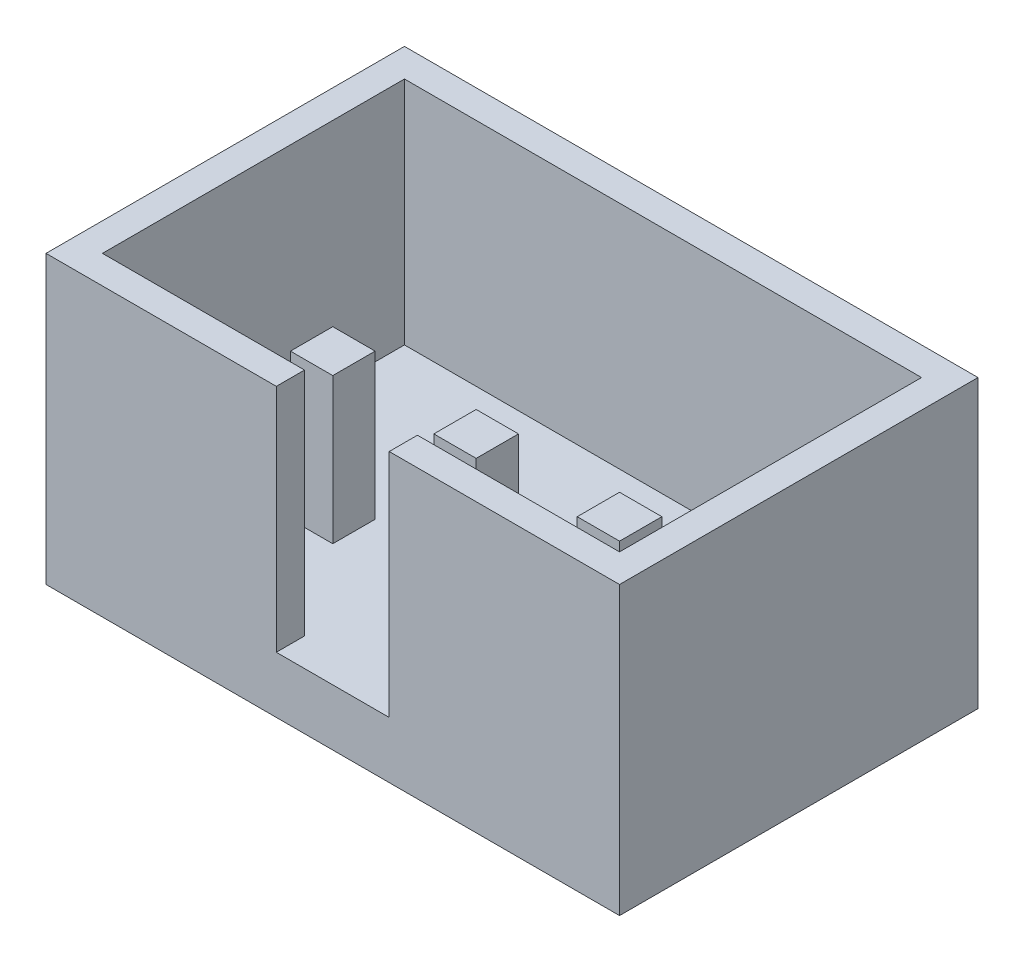
ISO-10303-21;
HEADER;
FILE_DESCRIPTION(('STEP AP214'),'2;1');
FILE_NAME('part.step','',(''),(''),'','','');
FILE_SCHEMA(('AUTOMOTIVE_DESIGN { 1 0 10303 214 1 1 1 1 }'));
ENDSEC;
DATA;
#1=APPLICATION_CONTEXT('core data for automotive mechanical design processes');
#2=APPLICATION_PROTOCOL_DEFINITION('international standard','automotive_design',2000,#1);
#3=PRODUCT_CONTEXT('',#1,'mechanical');
#4=PRODUCT('Part','Part','',(#3));
#5=PRODUCT_RELATED_PRODUCT_CATEGORY('part','',(#4));
#6=PRODUCT_DEFINITION_FORMATION('','',#4);
#7=PRODUCT_DEFINITION_CONTEXT('part definition',#1,'design');
#8=PRODUCT_DEFINITION('design','',#6,#7);
#9=PRODUCT_DEFINITION_SHAPE('','',#8);
#10=(LENGTH_UNIT() NAMED_UNIT(*) SI_UNIT(.MILLI.,.METRE.));
#11=(NAMED_UNIT(*) PLANE_ANGLE_UNIT() SI_UNIT($,.RADIAN.));
#12=(NAMED_UNIT(*) SI_UNIT($,.STERADIAN.) SOLID_ANGLE_UNIT());
#13=UNCERTAINTY_MEASURE_WITH_UNIT(LENGTH_MEASURE(1.E-05),#10,'distance_accuracy_value','');
#14=(GEOMETRIC_REPRESENTATION_CONTEXT(3) GLOBAL_UNCERTAINTY_ASSIGNED_CONTEXT((#13)) GLOBAL_UNIT_ASSIGNED_CONTEXT((#10,
#11,#12)) REPRESENTATION_CONTEXT('',''));
#15=CARTESIAN_POINT('',(0.,0.,0.));
#16=DIRECTION('',(0.,0.,1.));
#17=DIRECTION('',(1.,0.,0.));
#18=AXIS2_PLACEMENT_3D('',#15,#16,#17);
#19=CARTESIAN_POINT('',(-5.08,0.,3.175));
#20=DIRECTION('',(0.,1.,0.));
#21=DIRECTION('',(0.,0.,1.));
#22=AXIS2_PLACEMENT_3D('',#19,#20,#21);
#23=PLANE('',#22);
#24=DIRECTION('',(0.,0.,-1.));
#25=VECTOR('',#24,1.);
#26=CARTESIAN_POINT('',(2.165,0.,3.175));
#27=LINE('',#26,#25);
#28=CARTESIAN_POINT('',(2.165,0.,1.01));
#29=VERTEX_POINT('',#28);
#30=CARTESIAN_POINT('',(2.165,0.,0.259999999999999));
#31=VERTEX_POINT('',#30);
#32=EDGE_CURVE('E372',#29,#31,#27,.T.);
#33=ORIENTED_EDGE('',*,*,#32,.F.);
#34=DIRECTION('',(-1.,0.,0.));
#35=VECTOR('',#34,1.);
#36=CARTESIAN_POINT('',(-5.08,0.,1.01));
#37=LINE('',#36,#35);
#38=CARTESIAN_POINT('',(2.915,0.,1.01));
#39=VERTEX_POINT('',#38);
#40=EDGE_CURVE('E363',#39,#29,#37,.T.);
#41=ORIENTED_EDGE('',*,*,#40,.F.);
#42=DIRECTION('',(0.,0.,1.));
#43=VECTOR('',#42,1.);
#44=CARTESIAN_POINT('',(2.915,0.,3.175));
#45=LINE('',#44,#43);
#46=CARTESIAN_POINT('',(2.915,0.,0.259999999999999));
#47=VERTEX_POINT('',#46);
#48=EDGE_CURVE('E366',#47,#39,#45,.T.);
#49=ORIENTED_EDGE('',*,*,#48,.F.);
#50=DIRECTION('',(1.,0.,0.));
#51=VECTOR('',#50,1.);
#52=CARTESIAN_POINT('',(-5.08,0.,0.259999999999998));
#53=LINE('',#52,#51);
#54=EDGE_CURVE('E369',#31,#47,#53,.T.);
#55=ORIENTED_EDGE('',*,*,#54,.F.);
#56=EDGE_LOOP('',(#33,#41,#49,#55));
#57=FACE_BOUND('',#56,.T.);
#58=DIRECTION('',(0.,0.,1.));
#59=VECTOR('',#58,1.);
#60=CARTESIAN_POINT('',(-5.08,0.,-3.175));
#61=LINE('',#60,#59);
#62=CARTESIAN_POINT('',(-5.08,0.,-3.175));
#63=VERTEX_POINT('',#62);
#64=CARTESIAN_POINT('',(-5.08,0.,3.175));
#65=VERTEX_POINT('',#64);
#66=EDGE_CURVE('E479',#63,#65,#61,.T.);
#67=ORIENTED_EDGE('',*,*,#66,.F.);
#68=DIRECTION('',(-1.,0.,0.));
#69=VECTOR('',#68,1.);
#70=CARTESIAN_POINT('',(-5.08,0.,-3.175));
#71=LINE('',#70,#69);
#72=CARTESIAN_POINT('',(5.08,0.,-3.175));
#73=VERTEX_POINT('',#72);
#74=EDGE_CURVE('E484',#73,#63,#71,.T.);
#75=ORIENTED_EDGE('',*,*,#74,.F.);
#76=DIRECTION('',(0.,0.,-1.));
#77=VECTOR('',#76,1.);
#78=CARTESIAN_POINT('',(5.08,0.,-3.175));
#79=LINE('',#78,#77);
#80=CARTESIAN_POINT('',(5.08,0.,3.175));
#81=VERTEX_POINT('',#80);
#82=EDGE_CURVE('E497',#81,#73,#79,.T.);
#83=ORIENTED_EDGE('',*,*,#82,.F.);
#84=DIRECTION('',(1.,0.,0.));
#85=VECTOR('',#84,1.);
#86=CARTESIAN_POINT('',(-5.08,0.,3.175));
#87=LINE('',#86,#85);
#88=EDGE_CURVE('E495',#65,#81,#87,.T.);
#89=ORIENTED_EDGE('',*,*,#88,.F.);
#90=EDGE_LOOP('',(#67,#75,#83,#89));
#91=FACE_BOUND('',#90,.T.);
#92=DIRECTION('',(0.,0.,-1.));
#93=VECTOR('',#92,1.);
#94=CARTESIAN_POINT('',(-0.375,0.,3.175));
#95=LINE('',#94,#93);
#96=CARTESIAN_POINT('',(-0.375,0.,1.01));
#97=VERTEX_POINT('',#96);
#98=CARTESIAN_POINT('',(-0.374999999999999,0.,0.259999999999998));
#99=VERTEX_POINT('',#98);
#100=EDGE_CURVE('E421',#97,#99,#95,.T.);
#101=ORIENTED_EDGE('',*,*,#100,.F.);
#102=DIRECTION('',(-1.,0.,0.));
#103=VECTOR('',#102,1.);
#104=CARTESIAN_POINT('',(-5.08,0.,1.01));
#105=LINE('',#104,#103);
#106=CARTESIAN_POINT('',(0.375,0.,1.01));
#107=VERTEX_POINT('',#106);
#108=EDGE_CURVE('E412',#107,#97,#105,.T.);
#109=ORIENTED_EDGE('',*,*,#108,.F.);
#110=DIRECTION('',(0.,0.,1.));
#111=VECTOR('',#110,1.);
#112=CARTESIAN_POINT('',(0.375,0.,3.175));
#113=LINE('',#112,#111);
#114=CARTESIAN_POINT('',(0.375,0.,0.259999999999999));
#115=VERTEX_POINT('',#114);
#116=EDGE_CURVE('E415',#115,#107,#113,.T.);
#117=ORIENTED_EDGE('',*,*,#116,.F.);
#118=DIRECTION('',(1.,0.,0.));
#119=VECTOR('',#118,1.);
#120=CARTESIAN_POINT('',(-5.08,0.,0.259999999999998));
#121=LINE('',#120,#119);
#122=EDGE_CURVE('E418',#99,#115,#121,.T.);
#123=ORIENTED_EDGE('',*,*,#122,.F.);
#124=EDGE_LOOP('',(#101,#109,#117,#123));
#125=FACE_BOUND('',#124,.T.);
#126=DIRECTION('',(0.,0.,-1.));
#127=VECTOR('',#126,1.);
#128=CARTESIAN_POINT('',(-2.915,0.,3.175));
#129=LINE('',#128,#127);
#130=CARTESIAN_POINT('',(-2.915,0.,1.00999999999998));
#131=VERTEX_POINT('',#130);
#132=CARTESIAN_POINT('',(-2.915,0.,0.259999999999981));
#133=VERTEX_POINT('',#132);
#134=EDGE_CURVE('E324',#131,#133,#129,.T.);
#135=ORIENTED_EDGE('',*,*,#134,.F.);
#136=DIRECTION('',(-1.,0.,0.));
#137=VECTOR('',#136,1.);
#138=CARTESIAN_POINT('',(-5.08,0.,1.00999999999998));
#139=LINE('',#138,#137);
#140=CARTESIAN_POINT('',(-2.165,0.,1.00999999999998));
#141=VERTEX_POINT('',#140);
#142=EDGE_CURVE('E319',#141,#131,#139,.T.);
#143=ORIENTED_EDGE('',*,*,#142,.F.);
#144=DIRECTION('',(0.,0.,1.));
#145=VECTOR('',#144,1.);
#146=CARTESIAN_POINT('',(-2.165,0.,3.175));
#147=LINE('',#146,#145);
#148=CARTESIAN_POINT('',(-2.165,0.,0.259999999999981));
#149=VERTEX_POINT('',#148);
#150=EDGE_CURVE('E57',#149,#141,#147,.T.);
#151=ORIENTED_EDGE('',*,*,#150,.F.);
#152=DIRECTION('',(1.,0.,0.));
#153=VECTOR('',#152,1.);
#154=CARTESIAN_POINT('',(-5.08,0.,0.25999999999998));
#155=LINE('',#154,#153);
#156=EDGE_CURVE('E52',#133,#149,#155,.T.);
#157=ORIENTED_EDGE('',*,*,#156,.F.);
#158=EDGE_LOOP('',(#135,#143,#151,#157));
#159=FACE_BOUND('',#158,.T.);
#160=ADVANCED_FACE('F37',(#57,#91,#125,#159),#23,.F.);
#161=CARTESIAN_POINT('',(-5.08,1.,3.175));
#162=DIRECTION('',(0.,1.,0.));
#163=DIRECTION('',(0.,0.,1.));
#164=AXIS2_PLACEMENT_3D('',#161,#162,#163);
#165=PLANE('',#164);
#166=DIRECTION('',(-1.,0.,0.));
#167=VECTOR('',#166,1.);
#168=CARTESIAN_POINT('',(-5.08,1.,1.01));
#169=LINE('',#168,#167);
#170=CARTESIAN_POINT('',(2.915,1.,1.01));
#171=VERTEX_POINT('',#170);
#172=CARTESIAN_POINT('',(2.165,1.,1.01));
#173=VERTEX_POINT('',#172);
#174=EDGE_CURVE('E523',#171,#173,#169,.T.);
#175=ORIENTED_EDGE('',*,*,#174,.T.);
#176=DIRECTION('',(0.,0.,-1.));
#177=VECTOR('',#176,1.);
#178=CARTESIAN_POINT('',(2.165,1.,3.175));
#179=LINE('',#178,#177);
#180=CARTESIAN_POINT('',(2.165,1.,0.259999999999998));
#181=VERTEX_POINT('',#180);
#182=EDGE_CURVE('E532',#173,#181,#179,.T.);
#183=ORIENTED_EDGE('',*,*,#182,.T.);
#184=DIRECTION('',(1.,0.,0.));
#185=VECTOR('',#184,1.);
#186=CARTESIAN_POINT('',(-5.08,1.,0.259999999999998));
#187=LINE('',#186,#185);
#188=CARTESIAN_POINT('',(2.915,1.,0.259999999999998));
#189=VERTEX_POINT('',#188);
#190=EDGE_CURVE('E529',#181,#189,#187,.T.);
#191=ORIENTED_EDGE('',*,*,#190,.T.);
#192=DIRECTION('',(0.,0.,1.));
#193=VECTOR('',#192,1.);
#194=CARTESIAN_POINT('',(2.915,1.,3.175));
#195=LINE('',#194,#193);
#196=EDGE_CURVE('E526',#189,#171,#195,.T.);
#197=ORIENTED_EDGE('',*,*,#196,.T.);
#198=EDGE_LOOP('',(#175,#183,#191,#197));
#199=FACE_BOUND('',#198,.T.);
#200=DIRECTION('',(-1.,0.,0.));
#201=VECTOR('',#200,1.);
#202=CARTESIAN_POINT('',(-4.58,1.,2.675));
#203=LINE('',#202,#201);
#204=CARTESIAN_POINT('',(-0.999999999999999,1.,2.675));
#205=VERTEX_POINT('',#204);
#206=CARTESIAN_POINT('',(-4.58,1.,2.675));
#207=VERTEX_POINT('',#206);
#208=EDGE_CURVE('E452',#205,#207,#203,.T.);
#209=ORIENTED_EDGE('',*,*,#208,.F.);
#210=DIRECTION('',(0.,0.,1.));
#211=VECTOR('',#210,1.);
#212=CARTESIAN_POINT('',(-0.999999999999999,1.,2.175));
#213=LINE('',#212,#211);
#214=CARTESIAN_POINT('',(-0.999999999999999,1.,3.175));
#215=VERTEX_POINT('',#214);
#216=EDGE_CURVE('E432',#205,#215,#213,.T.);
#217=ORIENTED_EDGE('',*,*,#216,.T.);
#218=DIRECTION('',(1.,0.,0.));
#219=VECTOR('',#218,1.);
#220=CARTESIAN_POINT('',(-0.999999999999999,1.,3.175));
#221=LINE('',#220,#219);
#222=CARTESIAN_POINT('',(1.,1.,3.175));
#223=VERTEX_POINT('',#222);
#224=EDGE_CURVE('E427',#215,#223,#221,.T.);
#225=ORIENTED_EDGE('',*,*,#224,.T.);
#226=DIRECTION('',(0.,0.,1.));
#227=VECTOR('',#226,1.);
#228=CARTESIAN_POINT('',(1.,1.,2.175));
#229=LINE('',#228,#227);
#230=CARTESIAN_POINT('',(1.,1.,2.675));
#231=VERTEX_POINT('',#230);
#232=EDGE_CURVE('E439',#231,#223,#229,.T.);
#233=ORIENTED_EDGE('',*,*,#232,.F.);
#234=CARTESIAN_POINT('',(4.58,1.,2.675));
#235=VERTEX_POINT('',#234);
#236=EDGE_CURVE('E448',#235,#231,#203,.T.);
#237=ORIENTED_EDGE('',*,*,#236,.F.);
#238=DIRECTION('',(0.,0.,1.));
#239=VECTOR('',#238,1.);
#240=CARTESIAN_POINT('',(4.58,1.,2.675));
#241=LINE('',#240,#239);
#242=CARTESIAN_POINT('',(4.58,1.,-2.675));
#243=VERTEX_POINT('',#242);
#244=EDGE_CURVE('E451',#243,#235,#241,.T.);
#245=ORIENTED_EDGE('',*,*,#244,.F.);
#246=DIRECTION('',(1.,0.,0.));
#247=VECTOR('',#246,1.);
#248=CARTESIAN_POINT('',(4.58,1.,-2.675));
#249=LINE('',#248,#247);
#250=CARTESIAN_POINT('',(-4.58,1.,-2.675));
#251=VERTEX_POINT('',#250);
#252=EDGE_CURVE('E454',#251,#243,#249,.T.);
#253=ORIENTED_EDGE('',*,*,#252,.F.);
#254=DIRECTION('',(0.,0.,-1.));
#255=VECTOR('',#254,1.);
#256=CARTESIAN_POINT('',(-4.58,1.,-2.675));
#257=LINE('',#256,#255);
#258=EDGE_CURVE('E456',#207,#251,#257,.T.);
#259=ORIENTED_EDGE('',*,*,#258,.F.);
#260=EDGE_LOOP('',(#209,#217,#225,#233,#237,#245,#253,#259));
#261=FACE_BOUND('',#260,.T.);
#262=DIRECTION('',(-1.,0.,0.));
#263=VECTOR('',#262,1.);
#264=CARTESIAN_POINT('',(-5.08,1.,1.01));
#265=LINE('',#264,#263);
#266=CARTESIAN_POINT('',(0.375,1.,1.01));
#267=VERTEX_POINT('',#266);
#268=CARTESIAN_POINT('',(-0.375,1.,1.01));
#269=VERTEX_POINT('',#268);
#270=EDGE_CURVE('E511',#267,#269,#265,.T.);
#271=ORIENTED_EDGE('',*,*,#270,.T.);
#272=DIRECTION('',(0.,0.,-1.));
#273=VECTOR('',#272,1.);
#274=CARTESIAN_POINT('',(-0.375,1.,3.175));
#275=LINE('',#274,#273);
#276=CARTESIAN_POINT('',(-0.374999999999999,1.,0.259999999999998));
#277=VERTEX_POINT('',#276);
#278=EDGE_CURVE('E520',#269,#277,#275,.T.);
#279=ORIENTED_EDGE('',*,*,#278,.T.);
#280=DIRECTION('',(1.,0.,0.));
#281=VECTOR('',#280,1.);
#282=CARTESIAN_POINT('',(-5.08,1.,0.259999999999998));
#283=LINE('',#282,#281);
#284=CARTESIAN_POINT('',(0.375,1.,0.259999999999998));
#285=VERTEX_POINT('',#284);
#286=EDGE_CURVE('E517',#277,#285,#283,.T.);
#287=ORIENTED_EDGE('',*,*,#286,.T.);
#288=DIRECTION('',(0.,0.,1.));
#289=VECTOR('',#288,1.);
#290=CARTESIAN_POINT('',(0.375,1.,3.175));
#291=LINE('',#290,#289);
#292=EDGE_CURVE('E514',#285,#267,#291,.T.);
#293=ORIENTED_EDGE('',*,*,#292,.T.);
#294=EDGE_LOOP('',(#271,#279,#287,#293));
#295=FACE_BOUND('',#294,.T.);
#296=DIRECTION('',(-1.,0.,0.));
#297=VECTOR('',#296,1.);
#298=CARTESIAN_POINT('',(-5.08,1.,1.00999999999998));
#299=LINE('',#298,#297);
#300=CARTESIAN_POINT('',(-2.165,1.,1.00999999999998));
#301=VERTEX_POINT('',#300);
#302=CARTESIAN_POINT('',(-2.915,1.,1.00999999999998));
#303=VERTEX_POINT('',#302);
#304=EDGE_CURVE('E535',#301,#303,#299,.T.);
#305=ORIENTED_EDGE('',*,*,#304,.T.);
#306=DIRECTION('',(0.,0.,-1.));
#307=VECTOR('',#306,1.);
#308=CARTESIAN_POINT('',(-2.915,1.,3.175));
#309=LINE('',#308,#307);
#310=CARTESIAN_POINT('',(-2.915,1.,0.259999999999981));
#311=VERTEX_POINT('',#310);
#312=EDGE_CURVE('E12',#303,#311,#309,.T.);
#313=ORIENTED_EDGE('',*,*,#312,.T.);
#314=DIRECTION('',(1.,0.,0.));
#315=VECTOR('',#314,1.);
#316=CARTESIAN_POINT('',(-5.08,1.,0.25999999999998));
#317=LINE('',#316,#315);
#318=CARTESIAN_POINT('',(-2.165,1.,0.259999999999981));
#319=VERTEX_POINT('',#318);
#320=EDGE_CURVE('E45',#311,#319,#317,.T.);
#321=ORIENTED_EDGE('',*,*,#320,.T.);
#322=DIRECTION('',(0.,0.,1.));
#323=VECTOR('',#322,1.);
#324=CARTESIAN_POINT('',(-2.165,1.,3.175));
#325=LINE('',#324,#323);
#326=EDGE_CURVE('E274',#319,#301,#325,.T.);
#327=ORIENTED_EDGE('',*,*,#326,.T.);
#328=EDGE_LOOP('',(#305,#313,#321,#327));
#329=FACE_BOUND('',#328,.T.);
#330=ADVANCED_FACE('F539',(#199,#261,#295,#329),#165,.T.);
#331=CARTESIAN_POINT('',(-4.58,-10.6079262817951,2.675));
#332=DIRECTION('',(0.,0.,1.));
#333=DIRECTION('',(1.,0.,0.));
#334=AXIS2_PLACEMENT_3D('',#331,#332,#333);
#335=PLANE('',#334);
#336=DIRECTION('',(1.,0.,0.));
#337=VECTOR('',#336,1.);
#338=CARTESIAN_POINT('',(-4.58,5.08,2.675));
#339=LINE('',#338,#337);
#340=CARTESIAN_POINT('',(-4.58,5.08,2.675));
#341=VERTEX_POINT('',#340);
#342=CARTESIAN_POINT('',(-1.,5.08,2.675));
#343=VERTEX_POINT('',#342);
#344=EDGE_CURVE('E462',#341,#343,#339,.T.);
#345=ORIENTED_EDGE('',*,*,#344,.T.);
#346=DIRECTION('',(0.,-1.,0.));
#347=VECTOR('',#346,1.);
#348=CARTESIAN_POINT('',(-0.999999999999998,-10.6079262817951,2.675));
#349=LINE('',#348,#347);
#350=EDGE_CURVE('E444',#343,#205,#349,.T.);
#351=ORIENTED_EDGE('',*,*,#350,.T.);
#352=ORIENTED_EDGE('',*,*,#208,.T.);
#353=DIRECTION('',(0.,1.,0.));
#354=VECTOR('',#353,1.);
#355=CARTESIAN_POINT('',(-4.58,-10.6079262817951,2.675));
#356=LINE('',#355,#354);
#357=EDGE_CURVE('E474',#207,#341,#356,.T.);
#358=ORIENTED_EDGE('',*,*,#357,.T.);
#359=EDGE_LOOP('',(#345,#351,#352,#358));
#360=FACE_BOUND('',#359,.T.);
#361=ADVANCED_FACE('F566',(#360),#335,.F.);
#362=CARTESIAN_POINT('',(-5.08,5.08,-3.175));
#363=DIRECTION('',(1.,0.,0.));
#364=DIRECTION('',(0.,0.,-1.));
#365=AXIS2_PLACEMENT_3D('',#362,#363,#364);
#366=PLANE('',#365);
#367=ORIENTED_EDGE('',*,*,#66,.T.);
#368=DIRECTION('',(0.,-1.,0.));
#369=VECTOR('',#368,1.);
#370=CARTESIAN_POINT('',(-5.08,5.08,3.175));
#371=LINE('',#370,#369);
#372=CARTESIAN_POINT('',(-5.08,5.08,3.175));
#373=VERTEX_POINT('',#372);
#374=EDGE_CURVE('E508',#373,#65,#371,.T.);
#375=ORIENTED_EDGE('',*,*,#374,.F.);
#376=DIRECTION('',(0.,0.,1.));
#377=VECTOR('',#376,1.);
#378=CARTESIAN_POINT('',(-5.08,5.08,-3.175));
#379=LINE('',#378,#377);
#380=CARTESIAN_POINT('',(-5.08,5.08,-3.175));
#381=VERTEX_POINT('',#380);
#382=EDGE_CURVE('E480',#381,#373,#379,.T.);
#383=ORIENTED_EDGE('',*,*,#382,.F.);
#384=DIRECTION('',(0.,-1.,0.));
#385=VECTOR('',#384,1.);
#386=CARTESIAN_POINT('',(-5.08,5.08,-3.175));
#387=LINE('',#386,#385);
#388=EDGE_CURVE('E492',#381,#63,#387,.T.);
#389=ORIENTED_EDGE('',*,*,#388,.T.);
#390=EDGE_LOOP('',(#367,#375,#383,#389));
#391=FACE_BOUND('',#390,.T.);
#392=ADVANCED_FACE('F39',(#391),#366,.F.);
#393=CARTESIAN_POINT('',(-5.08,5.08,3.175));
#394=DIRECTION('',(0.,0.,-1.));
#395=DIRECTION('',(-1.,0.,0.));
#396=AXIS2_PLACEMENT_3D('',#393,#394,#395);
#397=PLANE('',#396);
#398=ORIENTED_EDGE('',*,*,#224,.F.);
#399=DIRECTION('',(0.,-1.,0.));
#400=VECTOR('',#399,1.);
#401=CARTESIAN_POINT('',(-1.,5.08,3.175));
#402=LINE('',#401,#400);
#403=CARTESIAN_POINT('',(-1.,5.08,3.175));
#404=VERTEX_POINT('',#403);
#405=EDGE_CURVE('E424',#404,#215,#402,.T.);
#406=ORIENTED_EDGE('',*,*,#405,.F.);
#407=DIRECTION('',(1.,0.,0.));
#408=VECTOR('',#407,1.);
#409=CARTESIAN_POINT('',(-5.08,5.08,3.175));
#410=LINE('',#409,#408);
#411=EDGE_CURVE('E485',#373,#404,#410,.T.);
#412=ORIENTED_EDGE('',*,*,#411,.F.);
#413=ORIENTED_EDGE('',*,*,#374,.T.);
#414=ORIENTED_EDGE('',*,*,#88,.T.);
#415=DIRECTION('',(0.,-1.,0.));
#416=VECTOR('',#415,1.);
#417=CARTESIAN_POINT('',(5.08,5.08,3.175));
#418=LINE('',#417,#416);
#419=CARTESIAN_POINT('',(5.08,5.08,3.175));
#420=VERTEX_POINT('',#419);
#421=EDGE_CURVE('E505',#420,#81,#418,.T.);
#422=ORIENTED_EDGE('',*,*,#421,.F.);
#423=CARTESIAN_POINT('',(1.,5.08,3.175));
#424=VERTEX_POINT('',#423);
#425=EDGE_CURVE('E483',#424,#420,#410,.T.);
#426=ORIENTED_EDGE('',*,*,#425,.F.);
#427=DIRECTION('',(0.,1.,0.));
#428=VECTOR('',#427,1.);
#429=CARTESIAN_POINT('',(1.,5.08,3.175));
#430=LINE('',#429,#428);
#431=EDGE_CURVE('E430',#223,#424,#430,.T.);
#432=ORIENTED_EDGE('',*,*,#431,.F.);
#433=EDGE_LOOP('',(#398,#406,#412,#413,#414,#422,#426,#432));
#434=FACE_BOUND('',#433,.T.);
#435=ADVANCED_FACE('F580',(#434),#397,.F.);
#436=CARTESIAN_POINT('',(5.08,5.08,-3.175));
#437=DIRECTION('',(-1.,0.,0.));
#438=DIRECTION('',(0.,0.,1.));
#439=AXIS2_PLACEMENT_3D('',#436,#437,#438);
#440=PLANE('',#439);
#441=ORIENTED_EDGE('',*,*,#82,.T.);
#442=DIRECTION('',(0.,-1.,0.));
#443=VECTOR('',#442,1.);
#444=CARTESIAN_POINT('',(5.08,5.08,-3.175));
#445=LINE('',#444,#443);
#446=CARTESIAN_POINT('',(5.08,5.08,-3.175));
#447=VERTEX_POINT('',#446);
#448=EDGE_CURVE('E502',#447,#73,#445,.T.);
#449=ORIENTED_EDGE('',*,*,#448,.F.);
#450=DIRECTION('',(0.,0.,-1.));
#451=VECTOR('',#450,1.);
#452=CARTESIAN_POINT('',(5.08,5.08,-3.175));
#453=LINE('',#452,#451);
#454=EDGE_CURVE('E488',#420,#447,#453,.T.);
#455=ORIENTED_EDGE('',*,*,#454,.F.);
#456=ORIENTED_EDGE('',*,*,#421,.T.);
#457=EDGE_LOOP('',(#441,#449,#455,#456));
#458=FACE_BOUND('',#457,.T.);
#459=ADVANCED_FACE('F577',(#458),#440,.F.);
#460=CARTESIAN_POINT('',(-5.08,5.08,-3.175));
#461=DIRECTION('',(0.,0.,1.));
#462=DIRECTION('',(1.,0.,0.));
#463=AXIS2_PLACEMENT_3D('',#460,#461,#462);
#464=PLANE('',#463);
#465=ORIENTED_EDGE('',*,*,#74,.T.);
#466=ORIENTED_EDGE('',*,*,#388,.F.);
#467=DIRECTION('',(-1.,0.,0.));
#468=VECTOR('',#467,1.);
#469=CARTESIAN_POINT('',(-5.08,5.08,-3.175));
#470=LINE('',#469,#468);
#471=EDGE_CURVE('E490',#447,#381,#470,.T.);
#472=ORIENTED_EDGE('',*,*,#471,.F.);
#473=ORIENTED_EDGE('',*,*,#448,.T.);
#474=EDGE_LOOP('',(#465,#466,#472,#473));
#475=FACE_BOUND('',#474,.T.);
#476=ADVANCED_FACE('F574',(#475),#464,.F.);
#477=CARTESIAN_POINT('',(-5.08,5.08,3.175));
#478=DIRECTION('',(0.,1.,0.));
#479=DIRECTION('',(0.,0.,1.));
#480=AXIS2_PLACEMENT_3D('',#477,#478,#479);
#481=PLANE('',#480);
#482=DIRECTION('',(0.,0.,1.));
#483=VECTOR('',#482,1.);
#484=CARTESIAN_POINT('',(-1.,5.08,2.175));
#485=LINE('',#484,#483);
#486=EDGE_CURVE('E433',#343,#404,#485,.T.);
#487=ORIENTED_EDGE('',*,*,#486,.F.);
#488=ORIENTED_EDGE('',*,*,#344,.F.);
#489=DIRECTION('',(0.,0.,1.));
#490=VECTOR('',#489,1.);
#491=CARTESIAN_POINT('',(-4.58,5.08,-2.675));
#492=LINE('',#491,#490);
#493=CARTESIAN_POINT('',(-4.58,5.08,-2.675));
#494=VERTEX_POINT('',#493);
#495=EDGE_CURVE('E458',#494,#341,#492,.T.);
#496=ORIENTED_EDGE('',*,*,#495,.F.);
#497=DIRECTION('',(-1.,0.,0.));
#498=VECTOR('',#497,1.);
#499=CARTESIAN_POINT('',(4.58,5.08,-2.675));
#500=LINE('',#499,#498);
#501=CARTESIAN_POINT('',(4.58,5.08,-2.675));
#502=VERTEX_POINT('',#501);
#503=EDGE_CURVE('E447',#502,#494,#500,.T.);
#504=ORIENTED_EDGE('',*,*,#503,.F.);
#505=DIRECTION('',(0.,0.,-1.));
#506=VECTOR('',#505,1.);
#507=CARTESIAN_POINT('',(4.58,5.08,2.675));
#508=LINE('',#507,#506);
#509=CARTESIAN_POINT('',(4.58,5.08,2.675));
#510=VERTEX_POINT('',#509);
#511=EDGE_CURVE('E465',#510,#502,#508,.T.);
#512=ORIENTED_EDGE('',*,*,#511,.F.);
#513=CARTESIAN_POINT('',(1.,5.08,2.675));
#514=VERTEX_POINT('',#513);
#515=EDGE_CURVE('E461',#514,#510,#339,.T.);
#516=ORIENTED_EDGE('',*,*,#515,.F.);
#517=DIRECTION('',(0.,0.,1.));
#518=VECTOR('',#517,1.);
#519=CARTESIAN_POINT('',(1.,5.08,2.175));
#520=LINE('',#519,#518);
#521=EDGE_CURVE('E436',#514,#424,#520,.T.);
#522=ORIENTED_EDGE('',*,*,#521,.T.);
#523=ORIENTED_EDGE('',*,*,#425,.T.);
#524=ORIENTED_EDGE('',*,*,#454,.T.);
#525=ORIENTED_EDGE('',*,*,#471,.T.);
#526=ORIENTED_EDGE('',*,*,#382,.T.);
#527=ORIENTED_EDGE('',*,*,#411,.T.);
#528=EDGE_LOOP('',(#487,#488,#496,#504,#512,#516,#522,#523,#524,#525,#526,#527));
#529=FACE_BOUND('',#528,.T.);
#530=ADVANCED_FACE('F572',(#529),#481,.T.);
#531=CARTESIAN_POINT('',(4.58,-10.6079262817951,-2.675));
#532=DIRECTION('',(0.,0.,-1.));
#533=DIRECTION('',(-1.,0.,0.));
#534=AXIS2_PLACEMENT_3D('',#531,#532,#533);
#535=PLANE('',#534);
#536=ORIENTED_EDGE('',*,*,#252,.T.);
#537=DIRECTION('',(0.,1.,0.));
#538=VECTOR('',#537,1.);
#539=CARTESIAN_POINT('',(4.58,-10.6079262817951,-2.675));
#540=LINE('',#539,#538);
#541=EDGE_CURVE('E469',#243,#502,#540,.T.);
#542=ORIENTED_EDGE('',*,*,#541,.T.);
#543=ORIENTED_EDGE('',*,*,#503,.T.);
#544=DIRECTION('',(0.,1.,0.));
#545=VECTOR('',#544,1.);
#546=CARTESIAN_POINT('',(-4.58,-10.6079262817951,-2.675));
#547=LINE('',#546,#545);
#548=EDGE_CURVE('E468',#251,#494,#547,.T.);
#549=ORIENTED_EDGE('',*,*,#548,.F.);
#550=EDGE_LOOP('',(#536,#542,#543,#549));
#551=FACE_BOUND('',#550,.T.);
#552=ADVANCED_FACE('F613',(#551),#535,.F.);
#553=CARTESIAN_POINT('',(4.58,-10.6079262817951,2.675));
#554=DIRECTION('',(1.,0.,0.));
#555=DIRECTION('',(0.,0.,-1.));
#556=AXIS2_PLACEMENT_3D('',#553,#554,#555);
#557=PLANE('',#556);
#558=ORIENTED_EDGE('',*,*,#244,.T.);
#559=DIRECTION('',(0.,1.,0.));
#560=VECTOR('',#559,1.);
#561=CARTESIAN_POINT('',(4.58,-10.6079262817951,2.675));
#562=LINE('',#561,#560);
#563=EDGE_CURVE('E471',#235,#510,#562,.T.);
#564=ORIENTED_EDGE('',*,*,#563,.T.);
#565=ORIENTED_EDGE('',*,*,#511,.T.);
#566=ORIENTED_EDGE('',*,*,#541,.F.);
#567=EDGE_LOOP('',(#558,#564,#565,#566));
#568=FACE_BOUND('',#567,.T.);
#569=ADVANCED_FACE('F618',(#568),#557,.F.);
#570=ORIENTED_EDGE('',*,*,#236,.T.);
#571=DIRECTION('',(0.,1.,0.));
#572=VECTOR('',#571,1.);
#573=CARTESIAN_POINT('',(0.999999999999998,-10.6079262817951,2.675));
#574=LINE('',#573,#572);
#575=EDGE_CURVE('E435',#231,#514,#574,.T.);
#576=ORIENTED_EDGE('',*,*,#575,.T.);
#577=ORIENTED_EDGE('',*,*,#515,.T.);
#578=ORIENTED_EDGE('',*,*,#563,.F.);
#579=EDGE_LOOP('',(#570,#576,#577,#578));
#580=FACE_BOUND('',#579,.T.);
#581=ADVANCED_FACE('F621',(#580),#335,.F.);
#582=CARTESIAN_POINT('',(-4.58,-10.6079262817951,-2.675));
#583=DIRECTION('',(-1.,0.,0.));
#584=DIRECTION('',(0.,0.,1.));
#585=AXIS2_PLACEMENT_3D('',#582,#583,#584);
#586=PLANE('',#585);
#587=ORIENTED_EDGE('',*,*,#258,.T.);
#588=ORIENTED_EDGE('',*,*,#548,.T.);
#589=ORIENTED_EDGE('',*,*,#495,.T.);
#590=ORIENTED_EDGE('',*,*,#357,.F.);
#591=EDGE_LOOP('',(#587,#588,#589,#590));
#592=FACE_BOUND('',#591,.T.);
#593=ADVANCED_FACE('F607',(#592),#586,.F.);
#594=CARTESIAN_POINT('',(-1.,5.08,2.175));
#595=DIRECTION('',(-1.,0.,0.));
#596=DIRECTION('',(0.,-1.,0.));
#597=AXIS2_PLACEMENT_3D('',#594,#595,#596);
#598=PLANE('',#597);
#599=ORIENTED_EDGE('',*,*,#486,.T.);
#600=ORIENTED_EDGE('',*,*,#405,.T.);
#601=ORIENTED_EDGE('',*,*,#216,.F.);
#602=ORIENTED_EDGE('',*,*,#350,.F.);
#603=EDGE_LOOP('',(#599,#600,#601,#602));
#604=FACE_BOUND('',#603,.T.);
#605=ADVANCED_FACE('F599',(#604),#598,.F.);
#606=CARTESIAN_POINT('',(1.,5.08,2.175));
#607=DIRECTION('',(1.,0.,0.));
#608=DIRECTION('',(0.,1.,0.));
#609=AXIS2_PLACEMENT_3D('',#606,#607,#608);
#610=PLANE('',#609);
#611=ORIENTED_EDGE('',*,*,#232,.T.);
#612=ORIENTED_EDGE('',*,*,#431,.T.);
#613=ORIENTED_EDGE('',*,*,#521,.F.);
#614=ORIENTED_EDGE('',*,*,#575,.F.);
#615=EDGE_LOOP('',(#611,#612,#613,#614));
#616=FACE_BOUND('',#615,.T.);
#617=ADVANCED_FACE('F693',(#616),#610,.F.);
#618=CARTESIAN_POINT('',(-5.08,3.58,3.175));
#619=DIRECTION('',(0.,1.,0.));
#620=DIRECTION('',(0.,0.,1.));
#621=AXIS2_PLACEMENT_3D('',#618,#619,#620);
#622=PLANE('',#621);
#623=DIRECTION('',(0.,0.,-1.));
#624=VECTOR('',#623,1.);
#625=CARTESIAN_POINT('',(-0.375,3.58,1.01));
#626=LINE('',#625,#624);
#627=CARTESIAN_POINT('',(-0.375,3.58,1.01));
#628=VERTEX_POINT('',#627);
#629=CARTESIAN_POINT('',(-0.374999999999999,3.58,0.259999999999998));
#630=VERTEX_POINT('',#629);
#631=EDGE_CURVE('E379',#628,#630,#626,.T.);
#632=ORIENTED_EDGE('',*,*,#631,.F.);
#633=DIRECTION('',(-1.,0.,0.));
#634=VECTOR('',#633,1.);
#635=CARTESIAN_POINT('',(-0.375,3.58,1.01));
#636=LINE('',#635,#634);
#637=CARTESIAN_POINT('',(0.375,3.58,1.01));
#638=VERTEX_POINT('',#637);
#639=EDGE_CURVE('E383',#638,#628,#636,.T.);
#640=ORIENTED_EDGE('',*,*,#639,.F.);
#641=DIRECTION('',(0.,0.,1.));
#642=VECTOR('',#641,1.);
#643=CARTESIAN_POINT('',(0.375,3.58,1.01));
#644=LINE('',#643,#642);
#645=CARTESIAN_POINT('',(0.375,3.58,0.259999999999998));
#646=VERTEX_POINT('',#645);
#647=EDGE_CURVE('E378',#646,#638,#644,.T.);
#648=ORIENTED_EDGE('',*,*,#647,.F.);
#649=DIRECTION('',(1.,0.,0.));
#650=VECTOR('',#649,1.);
#651=CARTESIAN_POINT('',(-0.374999999999999,3.58,0.259999999999998));
#652=LINE('',#651,#650);
#653=EDGE_CURVE('E375',#630,#646,#652,.T.);
#654=ORIENTED_EDGE('',*,*,#653,.F.);
#655=EDGE_LOOP('',(#632,#640,#648,#654));
#656=FACE_BOUND('',#655,.T.);
#657=ADVANCED_FACE('F689',(#656),#622,.T.);
#658=CARTESIAN_POINT('',(-0.375,-2.,1.01));
#659=DIRECTION('',(0.,0.,-1.));
#660=DIRECTION('',(-1.,0.,0.));
#661=AXIS2_PLACEMENT_3D('',#658,#659,#660);
#662=PLANE('',#661);
#663=ORIENTED_EDGE('',*,*,#270,.F.);
#664=DIRECTION('',(0.,1.,0.));
#665=VECTOR('',#664,1.);
#666=CARTESIAN_POINT('',(0.375,-2.,1.01));
#667=LINE('',#666,#665);
#668=EDGE_CURVE('E400',#267,#638,#667,.T.);
#669=ORIENTED_EDGE('',*,*,#668,.T.);
#670=ORIENTED_EDGE('',*,*,#639,.T.);
#671=DIRECTION('',(0.,1.,0.));
#672=VECTOR('',#671,1.);
#673=CARTESIAN_POINT('',(-0.375,-2.,1.01));
#674=LINE('',#673,#672);
#675=EDGE_CURVE('E396',#269,#628,#674,.T.);
#676=ORIENTED_EDGE('',*,*,#675,.F.);
#677=EDGE_LOOP('',(#663,#669,#670,#676));
#678=FACE_BOUND('',#677,.T.);
#679=ADVANCED_FACE('F692',(#678),#662,.F.);
#680=CARTESIAN_POINT('',(0.375,-2.,1.01));
#681=DIRECTION('',(-1.,0.,0.));
#682=DIRECTION('',(0.,0.,1.));
#683=AXIS2_PLACEMENT_3D('',#680,#681,#682);
#684=PLANE('',#683);
#685=ORIENTED_EDGE('',*,*,#292,.F.);
#686=DIRECTION('',(0.,1.,0.));
#687=VECTOR('',#686,1.);
#688=CARTESIAN_POINT('',(0.375,-2.,0.259999999999998));
#689=LINE('',#688,#687);
#690=EDGE_CURVE('E404',#285,#646,#689,.T.);
#691=ORIENTED_EDGE('',*,*,#690,.T.);
#692=ORIENTED_EDGE('',*,*,#647,.T.);
#693=ORIENTED_EDGE('',*,*,#668,.F.);
#694=EDGE_LOOP('',(#685,#691,#692,#693));
#695=FACE_BOUND('',#694,.T.);
#696=ADVANCED_FACE('F701',(#695),#684,.F.);
#697=CARTESIAN_POINT('',(-0.374999999999999,-2.,0.259999999999998));
#698=DIRECTION('',(0.,0.,1.));
#699=DIRECTION('',(1.,0.,0.));
#700=AXIS2_PLACEMENT_3D('',#697,#698,#699);
#701=PLANE('',#700);
#702=ORIENTED_EDGE('',*,*,#286,.F.);
#703=DIRECTION('',(0.,1.,0.));
#704=VECTOR('',#703,1.);
#705=CARTESIAN_POINT('',(-0.374999999999999,-2.,0.259999999999998));
#706=LINE('',#705,#704);
#707=EDGE_CURVE('E408',#277,#630,#706,.T.);
#708=ORIENTED_EDGE('',*,*,#707,.T.);
#709=ORIENTED_EDGE('',*,*,#653,.T.);
#710=ORIENTED_EDGE('',*,*,#690,.F.);
#711=EDGE_LOOP('',(#702,#708,#709,#710));
#712=FACE_BOUND('',#711,.T.);
#713=ADVANCED_FACE('F705',(#712),#701,.F.);
#714=CARTESIAN_POINT('',(-0.375,-2.,1.01));
#715=DIRECTION('',(1.,0.,0.));
#716=DIRECTION('',(0.,0.,-1.));
#717=AXIS2_PLACEMENT_3D('',#714,#715,#716);
#718=PLANE('',#717);
#719=ORIENTED_EDGE('',*,*,#278,.F.);
#720=ORIENTED_EDGE('',*,*,#675,.T.);
#721=ORIENTED_EDGE('',*,*,#631,.T.);
#722=ORIENTED_EDGE('',*,*,#707,.F.);
#723=EDGE_LOOP('',(#719,#720,#721,#722));
#724=FACE_BOUND('',#723,.T.);
#725=ADVANCED_FACE('F710',(#724),#718,.F.);
#726=CARTESIAN_POINT('',(-0.375,-2.,1.01));
#727=VERTEX_POINT('',#726);
#728=EDGE_CURVE('E397',#727,#97,#674,.T.);
#729=ORIENTED_EDGE('',*,*,#728,.T.);
#730=ORIENTED_EDGE('',*,*,#100,.T.);
#731=CARTESIAN_POINT('',(-0.374999999999999,-2.,0.259999999999998));
#732=VERTEX_POINT('',#731);
#733=EDGE_CURVE('E409',#732,#99,#706,.T.);
#734=ORIENTED_EDGE('',*,*,#733,.F.);
#735=DIRECTION('',(0.,0.,-1.));
#736=VECTOR('',#735,1.);
#737=CARTESIAN_POINT('',(-0.375,-2.,1.01));
#738=LINE('',#737,#736);
#739=EDGE_CURVE('E382',#727,#732,#738,.T.);
#740=ORIENTED_EDGE('',*,*,#739,.F.);
#741=EDGE_LOOP('',(#729,#730,#734,#740));
#742=FACE_BOUND('',#741,.T.);
#743=ADVANCED_FACE('F715',(#742),#718,.F.);
#744=ORIENTED_EDGE('',*,*,#733,.T.);
#745=ORIENTED_EDGE('',*,*,#122,.T.);
#746=CARTESIAN_POINT('',(0.375,-2.,0.259999999999998));
#747=VERTEX_POINT('',#746);
#748=EDGE_CURVE('E405',#747,#115,#689,.T.);
#749=ORIENTED_EDGE('',*,*,#748,.F.);
#750=DIRECTION('',(1.,0.,0.));
#751=VECTOR('',#750,1.);
#752=CARTESIAN_POINT('',(-0.374999999999999,-2.,0.259999999999998));
#753=LINE('',#752,#751);
#754=EDGE_CURVE('E390',#732,#747,#753,.T.);
#755=ORIENTED_EDGE('',*,*,#754,.F.);
#756=EDGE_LOOP('',(#744,#745,#749,#755));
#757=FACE_BOUND('',#756,.T.);
#758=ADVANCED_FACE('F712',(#757),#701,.F.);
#759=ORIENTED_EDGE('',*,*,#748,.T.);
#760=ORIENTED_EDGE('',*,*,#116,.T.);
#761=CARTESIAN_POINT('',(0.375,-2.,1.01));
#762=VERTEX_POINT('',#761);
#763=EDGE_CURVE('E401',#762,#107,#667,.T.);
#764=ORIENTED_EDGE('',*,*,#763,.F.);
#765=DIRECTION('',(0.,0.,1.));
#766=VECTOR('',#765,1.);
#767=CARTESIAN_POINT('',(0.375,-2.,1.01));
#768=LINE('',#767,#766);
#769=EDGE_CURVE('E392',#747,#762,#768,.T.);
#770=ORIENTED_EDGE('',*,*,#769,.F.);
#771=EDGE_LOOP('',(#759,#760,#764,#770));
#772=FACE_BOUND('',#771,.T.);
#773=ADVANCED_FACE('F707',(#772),#684,.F.);
#774=ORIENTED_EDGE('',*,*,#763,.T.);
#775=ORIENTED_EDGE('',*,*,#108,.T.);
#776=ORIENTED_EDGE('',*,*,#728,.F.);
#777=DIRECTION('',(-1.,0.,0.));
#778=VECTOR('',#777,1.);
#779=CARTESIAN_POINT('',(-0.375,-2.,1.01));
#780=LINE('',#779,#778);
#781=EDGE_CURVE('E394',#762,#727,#780,.T.);
#782=ORIENTED_EDGE('',*,*,#781,.F.);
#783=EDGE_LOOP('',(#774,#775,#776,#782));
#784=FACE_BOUND('',#783,.T.);
#785=ADVANCED_FACE('F697',(#784),#662,.F.);
#786=CARTESIAN_POINT('',(-0.374999999999999,-2.,0.259999999999998));
#787=DIRECTION('',(0.,-1.,0.));
#788=DIRECTION('',(0.,0.,-1.));
#789=AXIS2_PLACEMENT_3D('',#786,#787,#788);
#790=PLANE('',#789);
#791=ORIENTED_EDGE('',*,*,#739,.T.);
#792=ORIENTED_EDGE('',*,*,#754,.T.);
#793=ORIENTED_EDGE('',*,*,#769,.T.);
#794=ORIENTED_EDGE('',*,*,#781,.T.);
#795=EDGE_LOOP('',(#791,#792,#793,#794));
#796=FACE_BOUND('',#795,.T.);
#797=ADVANCED_FACE('F665',(#796),#790,.T.);
#798=CARTESIAN_POINT('',(-5.08,3.58,3.175));
#799=DIRECTION('',(0.,1.,0.));
#800=DIRECTION('',(0.,0.,1.));
#801=AXIS2_PLACEMENT_3D('',#798,#799,#800);
#802=PLANE('',#801);
#803=DIRECTION('',(0.,0.,-1.));
#804=VECTOR('',#803,1.);
#805=CARTESIAN_POINT('',(2.165,3.58,1.01));
#806=LINE('',#805,#804);
#807=CARTESIAN_POINT('',(2.165,3.58,1.01));
#808=VERTEX_POINT('',#807);
#809=CARTESIAN_POINT('',(2.165,3.58,0.259999999999998));
#810=VERTEX_POINT('',#809);
#811=EDGE_CURVE('E330',#808,#810,#806,.T.);
#812=ORIENTED_EDGE('',*,*,#811,.F.);
#813=DIRECTION('',(-1.,0.,0.));
#814=VECTOR('',#813,1.);
#815=CARTESIAN_POINT('',(2.165,3.58,1.01));
#816=LINE('',#815,#814);
#817=CARTESIAN_POINT('',(2.915,3.58,1.01));
#818=VERTEX_POINT('',#817);
#819=EDGE_CURVE('E334',#818,#808,#816,.T.);
#820=ORIENTED_EDGE('',*,*,#819,.F.);
#821=DIRECTION('',(0.,0.,1.));
#822=VECTOR('',#821,1.);
#823=CARTESIAN_POINT('',(2.915,3.58,1.01));
#824=LINE('',#823,#822);
#825=CARTESIAN_POINT('',(2.915,3.58,0.259999999999998));
#826=VERTEX_POINT('',#825);
#827=EDGE_CURVE('E329',#826,#818,#824,.T.);
#828=ORIENTED_EDGE('',*,*,#827,.F.);
#829=DIRECTION('',(1.,0.,0.));
#830=VECTOR('',#829,1.);
#831=CARTESIAN_POINT('',(2.165,3.58,0.259999999999998));
#832=LINE('',#831,#830);
#833=EDGE_CURVE('E326',#810,#826,#832,.T.);
#834=ORIENTED_EDGE('',*,*,#833,.F.);
#835=EDGE_LOOP('',(#812,#820,#828,#834));
#836=FACE_BOUND('',#835,.T.);
#837=ADVANCED_FACE('F661',(#836),#802,.T.);
#838=CARTESIAN_POINT('',(2.165,-2.,1.01));
#839=DIRECTION('',(0.,0.,-1.));
#840=DIRECTION('',(-1.,0.,0.));
#841=AXIS2_PLACEMENT_3D('',#838,#839,#840);
#842=PLANE('',#841);
#843=ORIENTED_EDGE('',*,*,#174,.F.);
#844=DIRECTION('',(0.,1.,0.));
#845=VECTOR('',#844,1.);
#846=CARTESIAN_POINT('',(2.915,-2.,1.01));
#847=LINE('',#846,#845);
#848=EDGE_CURVE('E351',#171,#818,#847,.T.);
#849=ORIENTED_EDGE('',*,*,#848,.T.);
#850=ORIENTED_EDGE('',*,*,#819,.T.);
#851=DIRECTION('',(0.,1.,0.));
#852=VECTOR('',#851,1.);
#853=CARTESIAN_POINT('',(2.165,-2.,1.01));
#854=LINE('',#853,#852);
#855=EDGE_CURVE('E347',#173,#808,#854,.T.);
#856=ORIENTED_EDGE('',*,*,#855,.F.);
#857=EDGE_LOOP('',(#843,#849,#850,#856));
#858=FACE_BOUND('',#857,.T.);
#859=ADVANCED_FACE('F664',(#858),#842,.F.);
#860=CARTESIAN_POINT('',(2.915,-2.,1.01));
#861=DIRECTION('',(-1.,0.,0.));
#862=DIRECTION('',(0.,0.,1.));
#863=AXIS2_PLACEMENT_3D('',#860,#861,#862);
#864=PLANE('',#863);
#865=ORIENTED_EDGE('',*,*,#196,.F.);
#866=DIRECTION('',(0.,1.,0.));
#867=VECTOR('',#866,1.);
#868=CARTESIAN_POINT('',(2.915,-2.,0.259999999999998));
#869=LINE('',#868,#867);
#870=EDGE_CURVE('E355',#189,#826,#869,.T.);
#871=ORIENTED_EDGE('',*,*,#870,.T.);
#872=ORIENTED_EDGE('',*,*,#827,.T.);
#873=ORIENTED_EDGE('',*,*,#848,.F.);
#874=EDGE_LOOP('',(#865,#871,#872,#873));
#875=FACE_BOUND('',#874,.T.);
#876=ADVANCED_FACE('F673',(#875),#864,.F.);
#877=CARTESIAN_POINT('',(2.165,-2.,0.259999999999998));
#878=DIRECTION('',(0.,0.,1.));
#879=DIRECTION('',(1.,0.,0.));
#880=AXIS2_PLACEMENT_3D('',#877,#878,#879);
#881=PLANE('',#880);
#882=ORIENTED_EDGE('',*,*,#190,.F.);
#883=DIRECTION('',(0.,1.,0.));
#884=VECTOR('',#883,1.);
#885=CARTESIAN_POINT('',(2.165,-2.,0.259999999999998));
#886=LINE('',#885,#884);
#887=EDGE_CURVE('E359',#181,#810,#886,.T.);
#888=ORIENTED_EDGE('',*,*,#887,.T.);
#889=ORIENTED_EDGE('',*,*,#833,.T.);
#890=ORIENTED_EDGE('',*,*,#870,.F.);
#891=EDGE_LOOP('',(#882,#888,#889,#890));
#892=FACE_BOUND('',#891,.T.);
#893=ADVANCED_FACE('F677',(#892),#881,.F.);
#894=CARTESIAN_POINT('',(2.165,-2.,1.01));
#895=DIRECTION('',(1.,0.,0.));
#896=DIRECTION('',(0.,0.,-1.));
#897=AXIS2_PLACEMENT_3D('',#894,#895,#896);
#898=PLANE('',#897);
#899=ORIENTED_EDGE('',*,*,#182,.F.);
#900=ORIENTED_EDGE('',*,*,#855,.T.);
#901=ORIENTED_EDGE('',*,*,#811,.T.);
#902=ORIENTED_EDGE('',*,*,#887,.F.);
#903=EDGE_LOOP('',(#899,#900,#901,#902));
#904=FACE_BOUND('',#903,.T.);
#905=ADVANCED_FACE('F682',(#904),#898,.F.);
#906=CARTESIAN_POINT('',(2.165,-2.,1.01));
#907=VERTEX_POINT('',#906);
#908=EDGE_CURVE('E348',#907,#29,#854,.T.);
#909=ORIENTED_EDGE('',*,*,#908,.T.);
#910=ORIENTED_EDGE('',*,*,#32,.T.);
#911=CARTESIAN_POINT('',(2.165,-2.,0.259999999999998));
#912=VERTEX_POINT('',#911);
#913=EDGE_CURVE('E360',#912,#31,#886,.T.);
#914=ORIENTED_EDGE('',*,*,#913,.F.);
#915=DIRECTION('',(0.,0.,-1.));
#916=VECTOR('',#915,1.);
#917=CARTESIAN_POINT('',(2.165,-2.,1.01));
#918=LINE('',#917,#916);
#919=EDGE_CURVE('E333',#907,#912,#918,.T.);
#920=ORIENTED_EDGE('',*,*,#919,.F.);
#921=EDGE_LOOP('',(#909,#910,#914,#920));
#922=FACE_BOUND('',#921,.T.);
#923=ADVANCED_FACE('F687',(#922),#898,.F.);
#924=ORIENTED_EDGE('',*,*,#913,.T.);
#925=ORIENTED_EDGE('',*,*,#54,.T.);
#926=CARTESIAN_POINT('',(2.915,-2.,0.259999999999998));
#927=VERTEX_POINT('',#926);
#928=EDGE_CURVE('E356',#927,#47,#869,.T.);
#929=ORIENTED_EDGE('',*,*,#928,.F.);
#930=DIRECTION('',(1.,0.,0.));
#931=VECTOR('',#930,1.);
#932=CARTESIAN_POINT('',(2.165,-2.,0.259999999999998));
#933=LINE('',#932,#931);
#934=EDGE_CURVE('E341',#912,#927,#933,.T.);
#935=ORIENTED_EDGE('',*,*,#934,.F.);
#936=EDGE_LOOP('',(#924,#925,#929,#935));
#937=FACE_BOUND('',#936,.T.);
#938=ADVANCED_FACE('F684',(#937),#881,.F.);
#939=ORIENTED_EDGE('',*,*,#928,.T.);
#940=ORIENTED_EDGE('',*,*,#48,.T.);
#941=CARTESIAN_POINT('',(2.915,-2.,1.01));
#942=VERTEX_POINT('',#941);
#943=EDGE_CURVE('E352',#942,#39,#847,.T.);
#944=ORIENTED_EDGE('',*,*,#943,.F.);
#945=DIRECTION('',(0.,0.,1.));
#946=VECTOR('',#945,1.);
#947=CARTESIAN_POINT('',(2.915,-2.,1.01));
#948=LINE('',#947,#946);
#949=EDGE_CURVE('E343',#927,#942,#948,.T.);
#950=ORIENTED_EDGE('',*,*,#949,.F.);
#951=EDGE_LOOP('',(#939,#940,#944,#950));
#952=FACE_BOUND('',#951,.T.);
#953=ADVANCED_FACE('F679',(#952),#864,.F.);
#954=ORIENTED_EDGE('',*,*,#943,.T.);
#955=ORIENTED_EDGE('',*,*,#40,.T.);
#956=ORIENTED_EDGE('',*,*,#908,.F.);
#957=DIRECTION('',(-1.,0.,0.));
#958=VECTOR('',#957,1.);
#959=CARTESIAN_POINT('',(2.165,-2.,1.01));
#960=LINE('',#959,#958);
#961=EDGE_CURVE('E345',#942,#907,#960,.T.);
#962=ORIENTED_EDGE('',*,*,#961,.F.);
#963=EDGE_LOOP('',(#954,#955,#956,#962));
#964=FACE_BOUND('',#963,.T.);
#965=ADVANCED_FACE('F669',(#964),#842,.F.);
#966=CARTESIAN_POINT('',(2.165,-2.,1.01));
#967=DIRECTION('',(0.,-1.,0.));
#968=DIRECTION('',(0.,0.,-1.));
#969=AXIS2_PLACEMENT_3D('',#966,#967,#968);
#970=PLANE('',#969);
#971=ORIENTED_EDGE('',*,*,#919,.T.);
#972=ORIENTED_EDGE('',*,*,#934,.T.);
#973=ORIENTED_EDGE('',*,*,#949,.T.);
#974=ORIENTED_EDGE('',*,*,#961,.T.);
#975=EDGE_LOOP('',(#971,#972,#973,#974));
#976=FACE_BOUND('',#975,.T.);
#977=ADVANCED_FACE('F554',(#976),#970,.T.);
#978=CARTESIAN_POINT('',(-5.08,3.58,3.175));
#979=DIRECTION('',(0.,1.,0.));
#980=DIRECTION('',(0.,0.,1.));
#981=AXIS2_PLACEMENT_3D('',#978,#979,#980);
#982=PLANE('',#981);
#983=DIRECTION('',(0.,0.,-1.));
#984=VECTOR('',#983,1.);
#985=CARTESIAN_POINT('',(-2.915,3.58,1.00999999999998));
#986=LINE('',#985,#984);
#987=CARTESIAN_POINT('',(-2.915,3.58,1.00999999999998));
#988=VERTEX_POINT('',#987);
#989=CARTESIAN_POINT('',(-2.915,3.58,0.259999999999981));
#990=VERTEX_POINT('',#989);
#991=EDGE_CURVE('E296',#988,#990,#986,.T.);
#992=ORIENTED_EDGE('',*,*,#991,.F.);
#993=DIRECTION('',(-1.,0.,0.));
#994=VECTOR('',#993,1.);
#995=CARTESIAN_POINT('',(-2.915,3.58,1.00999999999998));
#996=LINE('',#995,#994);
#997=CARTESIAN_POINT('',(-2.165,3.58,1.00999999999998));
#998=VERTEX_POINT('',#997);
#999=EDGE_CURVE('E289',#998,#988,#996,.T.);
#1000=ORIENTED_EDGE('',*,*,#999,.F.);
#1001=DIRECTION('',(0.,0.,1.));
#1002=VECTOR('',#1001,1.);
#1003=CARTESIAN_POINT('',(-2.165,3.58,1.00999999999998));
#1004=LINE('',#1003,#1002);
#1005=CARTESIAN_POINT('',(-2.165,3.58,0.259999999999981));
#1006=VERTEX_POINT('',#1005);
#1007=EDGE_CURVE('E272',#1006,#998,#1004,.T.);
#1008=ORIENTED_EDGE('',*,*,#1007,.F.);
#1009=DIRECTION('',(1.,0.,0.));
#1010=VECTOR('',#1009,1.);
#1011=CARTESIAN_POINT('',(-2.915,3.58,0.259999999999981));
#1012=LINE('',#1011,#1010);
#1013=EDGE_CURVE('E286',#990,#1006,#1012,.T.);
#1014=ORIENTED_EDGE('',*,*,#1013,.F.);
#1015=EDGE_LOOP('',(#992,#1000,#1008,#1014));
#1016=FACE_BOUND('',#1015,.T.);
#1017=ADVANCED_FACE('F285',(#1016),#982,.T.);
#1018=CARTESIAN_POINT('',(-2.915,-2.,1.00999999999998));
#1019=DIRECTION('',(0.,0.,-1.));
#1020=DIRECTION('',(-1.,0.,0.));
#1021=AXIS2_PLACEMENT_3D('',#1018,#1019,#1020);
#1022=PLANE('',#1021);
#1023=ORIENTED_EDGE('',*,*,#304,.F.);
#1024=DIRECTION('',(0.,1.,0.));
#1025=VECTOR('',#1024,1.);
#1026=CARTESIAN_POINT('',(-2.165,-2.,1.00999999999998));
#1027=LINE('',#1026,#1025);
#1028=EDGE_CURVE('E312',#301,#998,#1027,.T.);
#1029=ORIENTED_EDGE('',*,*,#1028,.T.);
#1030=ORIENTED_EDGE('',*,*,#999,.T.);
#1031=DIRECTION('',(0.,1.,0.));
#1032=VECTOR('',#1031,1.);
#1033=CARTESIAN_POINT('',(-2.915,-2.,1.00999999999998));
#1034=LINE('',#1033,#1032);
#1035=EDGE_CURVE('E308',#303,#988,#1034,.T.);
#1036=ORIENTED_EDGE('',*,*,#1035,.F.);
#1037=EDGE_LOOP('',(#1023,#1029,#1030,#1036));
#1038=FACE_BOUND('',#1037,.T.);
#1039=ADVANCED_FACE('F544',(#1038),#1022,.F.);
#1040=CARTESIAN_POINT('',(-2.165,-2.,1.00999999999998));
#1041=DIRECTION('',(-1.,0.,0.));
#1042=DIRECTION('',(0.,0.,1.));
#1043=AXIS2_PLACEMENT_3D('',#1040,#1041,#1042);
#1044=PLANE('',#1043);
#1045=ORIENTED_EDGE('',*,*,#326,.F.);
#1046=DIRECTION('',(0.,1.,0.));
#1047=VECTOR('',#1046,1.);
#1048=CARTESIAN_POINT('',(-2.165,-2.,0.259999999999981));
#1049=LINE('',#1048,#1047);
#1050=EDGE_CURVE('E268',#319,#1006,#1049,.T.);
#1051=ORIENTED_EDGE('',*,*,#1050,.T.);
#1052=ORIENTED_EDGE('',*,*,#1007,.T.);
#1053=ORIENTED_EDGE('',*,*,#1028,.F.);
#1054=EDGE_LOOP('',(#1045,#1051,#1052,#1053));
#1055=FACE_BOUND('',#1054,.T.);
#1056=ADVANCED_FACE('F270',(#1055),#1044,.F.);
#1057=CARTESIAN_POINT('',(-2.915,-2.,0.259999999999981));
#1058=DIRECTION('',(0.,0.,1.));
#1059=DIRECTION('',(1.,0.,0.));
#1060=AXIS2_PLACEMENT_3D('',#1057,#1058,#1059);
#1061=PLANE('',#1060);
#1062=ORIENTED_EDGE('',*,*,#320,.F.);
#1063=DIRECTION('',(0.,1.,0.));
#1064=VECTOR('',#1063,1.);
#1065=CARTESIAN_POINT('',(-2.915,-2.,0.259999999999981));
#1066=LINE('',#1065,#1064);
#1067=EDGE_CURVE('E293',#311,#990,#1066,.T.);
#1068=ORIENTED_EDGE('',*,*,#1067,.T.);
#1069=ORIENTED_EDGE('',*,*,#1013,.T.);
#1070=ORIENTED_EDGE('',*,*,#1050,.F.);
#1071=EDGE_LOOP('',(#1062,#1068,#1069,#1070));
#1072=FACE_BOUND('',#1071,.T.);
#1073=ADVANCED_FACE('F291',(#1072),#1061,.F.);
#1074=CARTESIAN_POINT('',(-2.915,-2.,1.00999999999998));
#1075=DIRECTION('',(1.,0.,0.));
#1076=DIRECTION('',(0.,0.,-1.));
#1077=AXIS2_PLACEMENT_3D('',#1074,#1075,#1076);
#1078=PLANE('',#1077);
#1079=ORIENTED_EDGE('',*,*,#312,.F.);
#1080=ORIENTED_EDGE('',*,*,#1035,.T.);
#1081=ORIENTED_EDGE('',*,*,#991,.T.);
#1082=ORIENTED_EDGE('',*,*,#1067,.F.);
#1083=EDGE_LOOP('',(#1079,#1080,#1081,#1082));
#1084=FACE_BOUND('',#1083,.T.);
#1085=ADVANCED_FACE('F542',(#1084),#1078,.F.);
#1086=CARTESIAN_POINT('',(-2.915,-2.,1.00999999999998));
#1087=VERTEX_POINT('',#1086);
#1088=EDGE_CURVE('E309',#1087,#131,#1034,.T.);
#1089=ORIENTED_EDGE('',*,*,#1088,.T.);
#1090=ORIENTED_EDGE('',*,*,#134,.T.);
#1091=CARTESIAN_POINT('',(-2.915,-2.,0.259999999999981));
#1092=VERTEX_POINT('',#1091);
#1093=EDGE_CURVE('E316',#1092,#133,#1066,.T.);
#1094=ORIENTED_EDGE('',*,*,#1093,.F.);
#1095=DIRECTION('',(0.,0.,-1.));
#1096=VECTOR('',#1095,1.);
#1097=CARTESIAN_POINT('',(-2.915,-2.,1.00999999999998));
#1098=LINE('',#1097,#1096);
#1099=EDGE_CURVE('E298',#1087,#1092,#1098,.T.);
#1100=ORIENTED_EDGE('',*,*,#1099,.F.);
#1101=EDGE_LOOP('',(#1089,#1090,#1094,#1100));
#1102=FACE_BOUND('',#1101,.T.);
#1103=ADVANCED_FACE('F640',(#1102),#1078,.F.);
#1104=ORIENTED_EDGE('',*,*,#1093,.T.);
#1105=ORIENTED_EDGE('',*,*,#156,.T.);
#1106=CARTESIAN_POINT('',(-2.165,-2.,0.259999999999981));
#1107=VERTEX_POINT('',#1106);
#1108=EDGE_CURVE('E278',#1107,#149,#1049,.T.);
#1109=ORIENTED_EDGE('',*,*,#1108,.F.);
#1110=DIRECTION('',(1.,0.,0.));
#1111=VECTOR('',#1110,1.);
#1112=CARTESIAN_POINT('',(-2.915,-2.,0.259999999999981));
#1113=LINE('',#1112,#1111);
#1114=EDGE_CURVE('E302',#1092,#1107,#1113,.T.);
#1115=ORIENTED_EDGE('',*,*,#1114,.F.);
#1116=EDGE_LOOP('',(#1104,#1105,#1109,#1115));
#1117=FACE_BOUND('',#1116,.T.);
#1118=ADVANCED_FACE('F646',(#1117),#1061,.F.);
#1119=ORIENTED_EDGE('',*,*,#1108,.T.);
#1120=ORIENTED_EDGE('',*,*,#150,.T.);
#1121=CARTESIAN_POINT('',(-2.165,-2.,1.00999999999998));
#1122=VERTEX_POINT('',#1121);
#1123=EDGE_CURVE('E279',#1122,#141,#1027,.T.);
#1124=ORIENTED_EDGE('',*,*,#1123,.F.);
#1125=DIRECTION('',(0.,0.,1.));
#1126=VECTOR('',#1125,1.);
#1127=CARTESIAN_POINT('',(-2.165,-2.,1.00999999999998));
#1128=LINE('',#1127,#1126);
#1129=EDGE_CURVE('E304',#1107,#1122,#1128,.T.);
#1130=ORIENTED_EDGE('',*,*,#1129,.F.);
#1131=EDGE_LOOP('',(#1119,#1120,#1124,#1130));
#1132=FACE_BOUND('',#1131,.T.);
#1133=ADVANCED_FACE('F553',(#1132),#1044,.F.);
#1134=ORIENTED_EDGE('',*,*,#1123,.T.);
#1135=ORIENTED_EDGE('',*,*,#142,.T.);
#1136=ORIENTED_EDGE('',*,*,#1088,.F.);
#1137=DIRECTION('',(-1.,0.,0.));
#1138=VECTOR('',#1137,1.);
#1139=CARTESIAN_POINT('',(-2.915,-2.,1.00999999999998));
#1140=LINE('',#1139,#1138);
#1141=EDGE_CURVE('E306',#1122,#1087,#1140,.T.);
#1142=ORIENTED_EDGE('',*,*,#1141,.F.);
#1143=EDGE_LOOP('',(#1134,#1135,#1136,#1142));
#1144=FACE_BOUND('',#1143,.T.);
#1145=ADVANCED_FACE('F547',(#1144),#1022,.F.);
#1146=CARTESIAN_POINT('',(-2.915,-2.,1.00999999999998));
#1147=DIRECTION('',(0.,-1.,0.));
#1148=DIRECTION('',(0.,0.,-1.));
#1149=AXIS2_PLACEMENT_3D('',#1146,#1147,#1148);
#1150=PLANE('',#1149);
#1151=ORIENTED_EDGE('',*,*,#1099,.T.);
#1152=ORIENTED_EDGE('',*,*,#1114,.T.);
#1153=ORIENTED_EDGE('',*,*,#1129,.T.);
#1154=ORIENTED_EDGE('',*,*,#1141,.T.);
#1155=EDGE_LOOP('',(#1151,#1152,#1153,#1154));
#1156=FACE_BOUND('',#1155,.T.);
#1157=ADVANCED_FACE('F558',(#1156),#1150,.T.);
#1158=CLOSED_SHELL('',(#160,#330,#361,#392,#435,#459,#476,#530,#552,#569,#581,#593,#605,#617,
#657,#679,#696,#713,#725,#743,#758,#773,#785,#797,#837,#859,#876,#893,#905,#923,#938,#953,#965,
#977,#1017,#1039,#1056,#1073,#1085,#1103,#1118,#1133,#1145,#1157));
#1159=MANIFOLD_SOLID_BREP('B2',#1158);
#1160=ADVANCED_BREP_SHAPE_REPRESENTATION('',(#18,#1159),#14);
#1161=SHAPE_DEFINITION_REPRESENTATION(#9,#1160);
ENDSEC;
END-ISO-10303-21;
